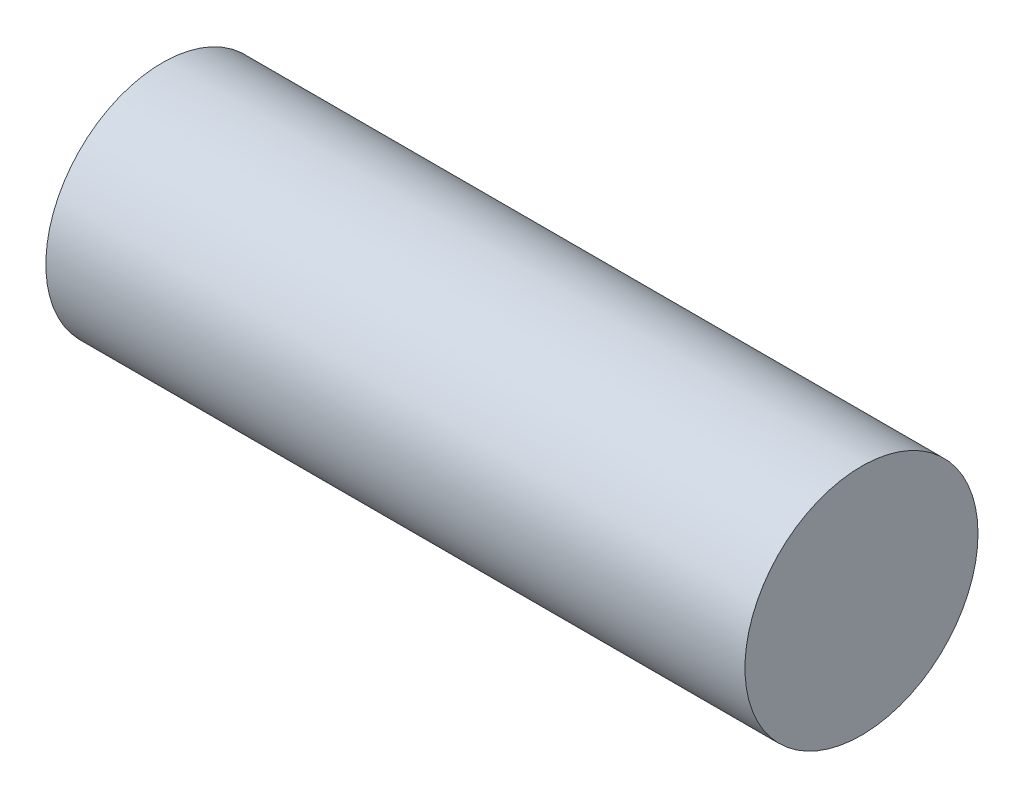
ISO-10303-21;
HEADER;
FILE_DESCRIPTION(('STEP AP214'),'2;1');
FILE_NAME('part.step','',(''),(''),'','','');
FILE_SCHEMA(('AUTOMOTIVE_DESIGN { 1 0 10303 214 1 1 1 1 }'));
ENDSEC;
DATA;
#1=APPLICATION_CONTEXT('core data for automotive mechanical design processes');
#2=APPLICATION_PROTOCOL_DEFINITION('international standard','automotive_design',2000,#1);
#3=PRODUCT_CONTEXT('',#1,'mechanical');
#4=PRODUCT('Part','Part','',(#3));
#5=PRODUCT_RELATED_PRODUCT_CATEGORY('part','',(#4));
#6=PRODUCT_DEFINITION_FORMATION('','',#4);
#7=PRODUCT_DEFINITION_CONTEXT('part definition',#1,'design');
#8=PRODUCT_DEFINITION('design','',#6,#7);
#9=PRODUCT_DEFINITION_SHAPE('','',#8);
#10=(LENGTH_UNIT() NAMED_UNIT(*) SI_UNIT(.MILLI.,.METRE.));
#11=(NAMED_UNIT(*) PLANE_ANGLE_UNIT() SI_UNIT($,.RADIAN.));
#12=(NAMED_UNIT(*) SI_UNIT($,.STERADIAN.) SOLID_ANGLE_UNIT());
#13=UNCERTAINTY_MEASURE_WITH_UNIT(LENGTH_MEASURE(1.E-05),#10,'distance_accuracy_value','');
#14=(GEOMETRIC_REPRESENTATION_CONTEXT(3) GLOBAL_UNCERTAINTY_ASSIGNED_CONTEXT((#13)) GLOBAL_UNIT_ASSIGNED_CONTEXT((#10,
#11,#12)) REPRESENTATION_CONTEXT('',''));
#15=CARTESIAN_POINT('',(0.,0.,0.));
#16=DIRECTION('',(0.,0.,1.));
#17=DIRECTION('',(1.,0.,0.));
#18=AXIS2_PLACEMENT_3D('',#15,#16,#17);
#19=CARTESIAN_POINT('',(457.2,0.,0.));
#20=DIRECTION('',(-1.,0.,0.));
#21=DIRECTION('',(0.,0.,1.));
#22=AXIS2_PLACEMENT_3D('',#19,#20,#21);
#23=CYLINDRICAL_SURFACE('',#22,76.2);
#24=CARTESIAN_POINT('',(457.2,0.,0.));
#25=DIRECTION('',(1.,0.,0.));
#26=DIRECTION('',(0.,0.,-1.));
#27=AXIS2_PLACEMENT_3D('',#24,#25,#26);
#28=CIRCLE('',#27,76.2);
#29=CARTESIAN_POINT('',(457.2,0.,-76.2));
#30=VERTEX_POINT('',#29);
#31=EDGE_CURVE('E10',#30,#30,#28,.T.);
#32=ORIENTED_EDGE('',*,*,#31,.F.);
#33=EDGE_LOOP('',(#32));
#34=FACE_BOUND('',#33,.T.);
#35=CARTESIAN_POINT('',(0.,0.,0.));
#36=DIRECTION('',(1.,0.,0.));
#37=DIRECTION('',(0.,0.,-1.));
#38=AXIS2_PLACEMENT_3D('',#35,#36,#37);
#39=CIRCLE('',#38,76.2);
#40=CARTESIAN_POINT('',(0.,0.,-76.2));
#41=VERTEX_POINT('',#40);
#42=EDGE_CURVE('E34',#41,#41,#39,.T.);
#43=ORIENTED_EDGE('',*,*,#42,.T.);
#44=EDGE_LOOP('',(#43));
#45=FACE_BOUND('',#44,.T.);
#46=ADVANCED_FACE('F31',(#34,#45),#23,.T.);
#47=CARTESIAN_POINT('',(457.2,0.,0.));
#48=DIRECTION('',(1.,0.,0.));
#49=DIRECTION('',(0.,0.,-1.));
#50=AXIS2_PLACEMENT_3D('',#47,#48,#49);
#51=PLANE('',#50);
#52=ORIENTED_EDGE('',*,*,#31,.T.);
#53=EDGE_LOOP('',(#52));
#54=FACE_BOUND('',#53,.T.);
#55=ADVANCED_FACE('F46',(#54),#51,.T.);
#56=CARTESIAN_POINT('',(0.,0.,0.));
#57=DIRECTION('',(1.,0.,0.));
#58=DIRECTION('',(0.,0.,-1.));
#59=AXIS2_PLACEMENT_3D('',#56,#57,#58);
#60=PLANE('',#59);
#61=ORIENTED_EDGE('',*,*,#42,.F.);
#62=EDGE_LOOP('',(#61));
#63=FACE_BOUND('',#62,.T.);
#64=ADVANCED_FACE('F44',(#63),#60,.F.);
#65=CLOSED_SHELL('',(#46,#55,#64));
#66=MANIFOLD_SOLID_BREP('B2',#65);
#67=ADVANCED_BREP_SHAPE_REPRESENTATION('',(#18,#66),#14);
#68=SHAPE_DEFINITION_REPRESENTATION(#9,#67);
ENDSEC;
END-ISO-10303-21;
